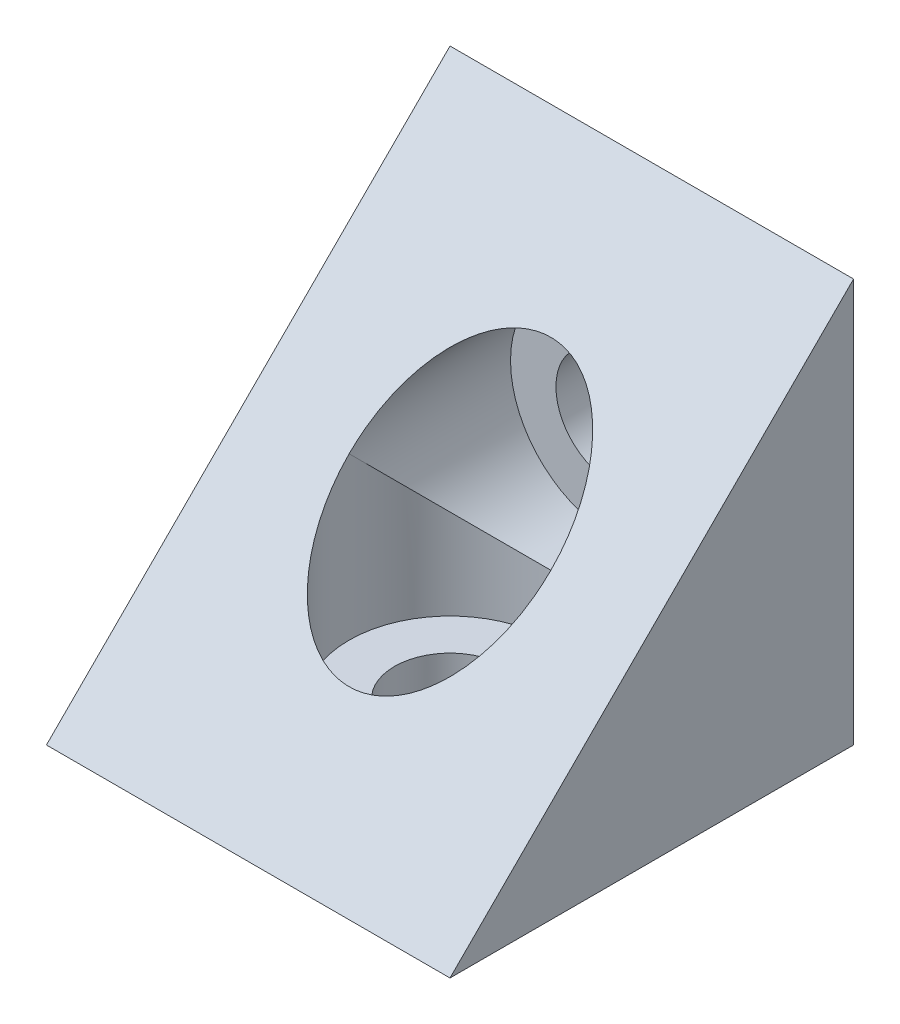
ISO-10303-21;
HEADER;
FILE_DESCRIPTION(('STEP AP214'),'2;1');
FILE_NAME('part.step','',(''),(''),'','','');
FILE_SCHEMA(('AUTOMOTIVE_DESIGN { 1 0 10303 214 1 1 1 1 }'));
ENDSEC;
DATA;
#1=APPLICATION_CONTEXT('core data for automotive mechanical design processes');
#2=APPLICATION_PROTOCOL_DEFINITION('international standard','automotive_design',2000,#1);
#3=PRODUCT_CONTEXT('',#1,'mechanical');
#4=PRODUCT('Part','Part','',(#3));
#5=PRODUCT_RELATED_PRODUCT_CATEGORY('part','',(#4));
#6=PRODUCT_DEFINITION_FORMATION('','',#4);
#7=PRODUCT_DEFINITION_CONTEXT('part definition',#1,'design');
#8=PRODUCT_DEFINITION('design','',#6,#7);
#9=PRODUCT_DEFINITION_SHAPE('','',#8);
#10=(LENGTH_UNIT() NAMED_UNIT(*) SI_UNIT(.MILLI.,.METRE.));
#11=(NAMED_UNIT(*) PLANE_ANGLE_UNIT() SI_UNIT($,.RADIAN.));
#12=(NAMED_UNIT(*) SI_UNIT($,.STERADIAN.) SOLID_ANGLE_UNIT());
#13=UNCERTAINTY_MEASURE_WITH_UNIT(LENGTH_MEASURE(1.E-05),#10,'distance_accuracy_value','');
#14=(GEOMETRIC_REPRESENTATION_CONTEXT(3) GLOBAL_UNCERTAINTY_ASSIGNED_CONTEXT((#13)) GLOBAL_UNIT_ASSIGNED_CONTEXT((#10,
#11,#12)) REPRESENTATION_CONTEXT('',''));
#15=CARTESIAN_POINT('',(0.,0.,0.));
#16=DIRECTION('',(0.,0.,1.));
#17=DIRECTION('',(1.,0.,0.));
#18=AXIS2_PLACEMENT_3D('',#15,#16,#17);
#19=CARTESIAN_POINT('',(0.,20.,10.));
#20=DIRECTION('',(0.,-1.,0.));
#21=DIRECTION('',(0.,0.,-1.));
#22=AXIS2_PLACEMENT_3D('',#19,#20,#21);
#23=CYLINDRICAL_SURFACE('',#22,2.75);
#24=CARTESIAN_POINT('',(0.,0.,10.));
#25=DIRECTION('',(0.,-1.,0.));
#26=DIRECTION('',(0.,0.,-1.));
#27=AXIS2_PLACEMENT_3D('',#24,#25,#26);
#28=CIRCLE('',#27,2.75);
#29=CARTESIAN_POINT('',(0.,0.,7.25));
#30=VERTEX_POINT('',#29);
#31=EDGE_CURVE('E95',#30,#30,#28,.T.);
#32=ORIENTED_EDGE('',*,*,#31,.T.);
#33=EDGE_LOOP('',(#32));
#34=FACE_BOUND('',#33,.T.);
#35=CARTESIAN_POINT('',(0.,2.,10.));
#36=DIRECTION('',(0.,1.,0.));
#37=DIRECTION('',(0.,0.,1.));
#38=AXIS2_PLACEMENT_3D('',#35,#36,#37);
#39=CIRCLE('',#38,2.75);
#40=CARTESIAN_POINT('',(0.,2.,12.75));
#41=VERTEX_POINT('',#40);
#42=EDGE_CURVE('E43',#41,#41,#39,.F.);
#43=ORIENTED_EDGE('',*,*,#42,.F.);
#44=EDGE_LOOP('',(#43));
#45=FACE_BOUND('',#44,.T.);
#46=ADVANCED_FACE('F39',(#34,#45),#23,.F.);
#47=CARTESIAN_POINT('',(0.,10.,20.));
#48=DIRECTION('',(0.,0.,-1.));
#49=DIRECTION('',(-1.,0.,0.));
#50=AXIS2_PLACEMENT_3D('',#47,#48,#49);
#51=CYLINDRICAL_SURFACE('',#50,5.);
#52=CARTESIAN_POINT('',(0.,10.,2.));
#53=DIRECTION('',(0.,0.,1.));
#54=DIRECTION('',(1.,0.,0.));
#55=AXIS2_PLACEMENT_3D('',#52,#53,#54);
#56=CIRCLE('',#55,5.);
#57=CARTESIAN_POINT('',(5.,10.,2.));
#58=VERTEX_POINT('',#57);
#59=EDGE_CURVE('E98',#58,#58,#56,.T.);
#60=ORIENTED_EDGE('',*,*,#59,.F.);
#61=EDGE_LOOP('',(#60));
#62=FACE_BOUND('',#61,.T.);
#63=CARTESIAN_POINT('',(0.,10.,10.));
#64=DIRECTION('',(0.,0.707106781186548,0.707106781186548));
#65=DIRECTION('',(0.,0.707106781186548,-0.707106781186548));
#66=AXIS2_PLACEMENT_3D('',#63,#64,#65);
#67=ELLIPSE('',#66,7.07106781186548,5.);
#68=CARTESIAN_POINT('',(-5.,10.,10.));
#69=VERTEX_POINT('',#68);
#70=CARTESIAN_POINT('',(5.,10.,10.));
#71=VERTEX_POINT('',#70);
#72=EDGE_CURVE('E83',#69,#71,#67,.F.);
#73=ORIENTED_EDGE('',*,*,#72,.F.);
#74=CARTESIAN_POINT('',(0.,10.,10.));
#75=DIRECTION('',(0.,0.707106781186547,-0.707106781186547));
#76=DIRECTION('',(0.,-0.707106781186547,-0.707106781186547));
#77=AXIS2_PLACEMENT_3D('',#74,#75,#76);
#78=ELLIPSE('',#77,7.07106781186548,5.);
#79=EDGE_CURVE('E11',#69,#71,#78,.F.);
#80=ORIENTED_EDGE('',*,*,#79,.T.);
#81=EDGE_LOOP('',(#73,#80));
#82=FACE_BOUND('',#81,.T.);
#83=ADVANCED_FACE('F84',(#62,#82),#51,.F.);
#84=CARTESIAN_POINT('',(0.,10.,20.));
#85=DIRECTION('',(0.,0.,-1.));
#86=DIRECTION('',(-1.,0.,0.));
#87=AXIS2_PLACEMENT_3D('',#84,#85,#86);
#88=CYLINDRICAL_SURFACE('',#87,2.75);
#89=CARTESIAN_POINT('',(0.,10.,0.));
#90=DIRECTION('',(0.,0.,-1.));
#91=DIRECTION('',(-1.,0.,0.));
#92=AXIS2_PLACEMENT_3D('',#89,#90,#91);
#93=CIRCLE('',#92,2.75);
#94=CARTESIAN_POINT('',(-2.75,10.,0.));
#95=VERTEX_POINT('',#94);
#96=EDGE_CURVE('E92',#95,#95,#93,.T.);
#97=ORIENTED_EDGE('',*,*,#96,.T.);
#98=EDGE_LOOP('',(#97));
#99=FACE_BOUND('',#98,.T.);
#100=CARTESIAN_POINT('',(0.,10.,2.));
#101=DIRECTION('',(0.,0.,1.));
#102=DIRECTION('',(1.,0.,0.));
#103=AXIS2_PLACEMENT_3D('',#100,#101,#102);
#104=CIRCLE('',#103,2.75);
#105=CARTESIAN_POINT('',(2.75,10.,2.));
#106=VERTEX_POINT('',#105);
#107=EDGE_CURVE('E87',#106,#106,#104,.F.);
#108=ORIENTED_EDGE('',*,*,#107,.F.);
#109=EDGE_LOOP('',(#108));
#110=FACE_BOUND('',#109,.T.);
#111=ADVANCED_FACE('F167',(#99,#110),#88,.F.);
#112=CARTESIAN_POINT('',(-10.,0.,0.));
#113=DIRECTION('',(0.,-1.,0.));
#114=DIRECTION('',(0.,0.,-1.));
#115=AXIS2_PLACEMENT_3D('',#112,#113,#114);
#116=PLANE('',#115);
#117=ORIENTED_EDGE('',*,*,#31,.F.);
#118=EDGE_LOOP('',(#117));
#119=FACE_BOUND('',#118,.T.);
#120=DIRECTION('',(1.,0.,0.));
#121=VECTOR('',#120,1.);
#122=CARTESIAN_POINT('',(-10.,0.,0.));
#123=LINE('',#122,#121);
#124=CARTESIAN_POINT('',(-10.,0.,0.));
#125=VERTEX_POINT('',#124);
#126=CARTESIAN_POINT('',(10.,0.,0.));
#127=VERTEX_POINT('',#126);
#128=EDGE_CURVE('E127',#125,#127,#123,.T.);
#129=ORIENTED_EDGE('',*,*,#128,.T.);
#130=DIRECTION('',(0.,0.,-1.));
#131=VECTOR('',#130,1.);
#132=CARTESIAN_POINT('',(10.,0.,0.));
#133=LINE('',#132,#131);
#134=CARTESIAN_POINT('',(10.,0.,20.));
#135=VERTEX_POINT('',#134);
#136=EDGE_CURVE('E104',#135,#127,#133,.T.);
#137=ORIENTED_EDGE('',*,*,#136,.F.);
#138=DIRECTION('',(1.,0.,0.));
#139=VECTOR('',#138,1.);
#140=CARTESIAN_POINT('',(-10.,0.,20.));
#141=LINE('',#140,#139);
#142=CARTESIAN_POINT('',(-10.,0.,20.));
#143=VERTEX_POINT('',#142);
#144=EDGE_CURVE('E49',#143,#135,#141,.T.);
#145=ORIENTED_EDGE('',*,*,#144,.F.);
#146=DIRECTION('',(0.,0.,-1.));
#147=VECTOR('',#146,1.);
#148=CARTESIAN_POINT('',(-10.,0.,0.));
#149=LINE('',#148,#147);
#150=EDGE_CURVE('E116',#143,#125,#149,.T.);
#151=ORIENTED_EDGE('',*,*,#150,.T.);
#152=EDGE_LOOP('',(#129,#137,#145,#151));
#153=FACE_BOUND('',#152,.T.);
#154=ADVANCED_FACE('F41',(#119,#153),#116,.T.);
#155=CARTESIAN_POINT('',(-10.,20.,0.));
#156=DIRECTION('',(0.,0.707106781186548,0.707106781186548));
#157=DIRECTION('',(0.,-0.707106781186548,0.707106781186548));
#158=AXIS2_PLACEMENT_3D('',#155,#156,#157);
#159=PLANE('',#158);
#160=EDGE_CURVE('E55',#71,#69,#67,.F.);
#161=ORIENTED_EDGE('',*,*,#160,.T.);
#162=ORIENTED_EDGE('',*,*,#72,.T.);
#163=EDGE_LOOP('',(#161,#162));
#164=FACE_BOUND('',#163,.T.);
#165=ORIENTED_EDGE('',*,*,#144,.T.);
#166=DIRECTION('',(0.,-0.707106781186548,0.707106781186548));
#167=VECTOR('',#166,1.);
#168=CARTESIAN_POINT('',(10.,20.,0.));
#169=LINE('',#168,#167);
#170=CARTESIAN_POINT('',(10.,20.,0.));
#171=VERTEX_POINT('',#170);
#172=EDGE_CURVE('E112',#171,#135,#169,.T.);
#173=ORIENTED_EDGE('',*,*,#172,.F.);
#174=DIRECTION('',(1.,0.,0.));
#175=VECTOR('',#174,1.);
#176=CARTESIAN_POINT('',(-10.,20.,0.));
#177=LINE('',#176,#175);
#178=CARTESIAN_POINT('',(-10.,20.,0.));
#179=VERTEX_POINT('',#178);
#180=EDGE_CURVE('E130',#179,#171,#177,.T.);
#181=ORIENTED_EDGE('',*,*,#180,.F.);
#182=DIRECTION('',(0.,-0.707106781186548,0.707106781186548));
#183=VECTOR('',#182,1.);
#184=CARTESIAN_POINT('',(-10.,20.,0.));
#185=LINE('',#184,#183);
#186=EDGE_CURVE('E123',#179,#143,#185,.T.);
#187=ORIENTED_EDGE('',*,*,#186,.T.);
#188=EDGE_LOOP('',(#165,#173,#181,#187));
#189=FACE_BOUND('',#188,.T.);
#190=ADVANCED_FACE('F89',(#164,#189),#159,.T.);
#191=CARTESIAN_POINT('',(-10.,0.,0.));
#192=DIRECTION('',(0.,0.,-1.));
#193=DIRECTION('',(-1.,0.,0.));
#194=AXIS2_PLACEMENT_3D('',#191,#192,#193);
#195=PLANE('',#194);
#196=ORIENTED_EDGE('',*,*,#96,.F.);
#197=EDGE_LOOP('',(#196));
#198=FACE_BOUND('',#197,.T.);
#199=ORIENTED_EDGE('',*,*,#180,.T.);
#200=DIRECTION('',(0.,1.,0.));
#201=VECTOR('',#200,1.);
#202=CARTESIAN_POINT('',(10.,0.,0.));
#203=LINE('',#202,#201);
#204=EDGE_CURVE('E108',#127,#171,#203,.T.);
#205=ORIENTED_EDGE('',*,*,#204,.F.);
#206=ORIENTED_EDGE('',*,*,#128,.F.);
#207=DIRECTION('',(0.,1.,0.));
#208=VECTOR('',#207,1.);
#209=CARTESIAN_POINT('',(-10.,0.,0.));
#210=LINE('',#209,#208);
#211=EDGE_CURVE('E119',#125,#179,#210,.T.);
#212=ORIENTED_EDGE('',*,*,#211,.T.);
#213=EDGE_LOOP('',(#199,#205,#206,#212));
#214=FACE_BOUND('',#213,.T.);
#215=ADVANCED_FACE('F180',(#198,#214),#195,.T.);
#216=CARTESIAN_POINT('',(-10.,0.,0.));
#217=DIRECTION('',(-1.,0.,0.));
#218=DIRECTION('',(0.,0.,1.));
#219=AXIS2_PLACEMENT_3D('',#216,#217,#218);
#220=PLANE('',#219);
#221=ORIENTED_EDGE('',*,*,#150,.F.);
#222=ORIENTED_EDGE('',*,*,#186,.F.);
#223=ORIENTED_EDGE('',*,*,#211,.F.);
#224=EDGE_LOOP('',(#221,#222,#223));
#225=FACE_BOUND('',#224,.T.);
#226=ADVANCED_FACE('F176',(#225),#220,.T.);
#227=CARTESIAN_POINT('',(10.,0.,0.));
#228=DIRECTION('',(-1.,0.,0.));
#229=DIRECTION('',(0.,0.,1.));
#230=AXIS2_PLACEMENT_3D('',#227,#228,#229);
#231=PLANE('',#230);
#232=ORIENTED_EDGE('',*,*,#136,.T.);
#233=ORIENTED_EDGE('',*,*,#204,.T.);
#234=ORIENTED_EDGE('',*,*,#172,.T.);
#235=EDGE_LOOP('',(#232,#233,#234));
#236=FACE_BOUND('',#235,.T.);
#237=ADVANCED_FACE('F173',(#236),#231,.F.);
#238=CARTESIAN_POINT('',(0.,10.,2.));
#239=DIRECTION('',(0.,0.,1.));
#240=DIRECTION('',(1.,0.,0.));
#241=AXIS2_PLACEMENT_3D('',#238,#239,#240);
#242=PLANE('',#241);
#243=ORIENTED_EDGE('',*,*,#59,.T.);
#244=EDGE_LOOP('',(#243));
#245=FACE_BOUND('',#244,.T.);
#246=ORIENTED_EDGE('',*,*,#107,.T.);
#247=EDGE_LOOP('',(#246));
#248=FACE_BOUND('',#247,.T.);
#249=ADVANCED_FACE('F158',(#245,#248),#242,.T.);
#250=CARTESIAN_POINT('',(0.,2.,10.));
#251=DIRECTION('',(0.,1.,0.));
#252=DIRECTION('',(0.,0.,1.));
#253=AXIS2_PLACEMENT_3D('',#250,#251,#252);
#254=PLANE('',#253);
#255=CARTESIAN_POINT('',(0.,2.,10.));
#256=DIRECTION('',(0.,1.,0.));
#257=DIRECTION('',(0.,0.,1.));
#258=AXIS2_PLACEMENT_3D('',#255,#256,#257);
#259=CIRCLE('',#258,5.);
#260=CARTESIAN_POINT('',(0.,2.,15.));
#261=VERTEX_POINT('',#260);
#262=EDGE_CURVE('E145',#261,#261,#259,.T.);
#263=ORIENTED_EDGE('',*,*,#262,.T.);
#264=EDGE_LOOP('',(#263));
#265=FACE_BOUND('',#264,.T.);
#266=ORIENTED_EDGE('',*,*,#42,.T.);
#267=EDGE_LOOP('',(#266));
#268=FACE_BOUND('',#267,.T.);
#269=ADVANCED_FACE('F152',(#265,#268),#254,.T.);
#270=CARTESIAN_POINT('',(0.,20.,10.));
#271=DIRECTION('',(0.,-1.,0.));
#272=DIRECTION('',(0.,0.,-1.));
#273=AXIS2_PLACEMENT_3D('',#270,#271,#272);
#274=CYLINDRICAL_SURFACE('',#273,5.);
#275=ORIENTED_EDGE('',*,*,#79,.F.);
#276=ORIENTED_EDGE('',*,*,#160,.F.);
#277=EDGE_LOOP('',(#275,#276));
#278=FACE_BOUND('',#277,.T.);
#279=ORIENTED_EDGE('',*,*,#262,.F.);
#280=EDGE_LOOP('',(#279));
#281=FACE_BOUND('',#280,.T.);
#282=ADVANCED_FACE('F79',(#278,#281),#274,.F.);
#283=CLOSED_SHELL('',(#46,#83,#111,#154,#190,#215,#226,#237,#249,#269,#282));
#284=MANIFOLD_SOLID_BREP('B2',#283);
#285=ADVANCED_BREP_SHAPE_REPRESENTATION('',(#18,#284),#14);
#286=SHAPE_DEFINITION_REPRESENTATION(#9,#285);
ENDSEC;
END-ISO-10303-21;
